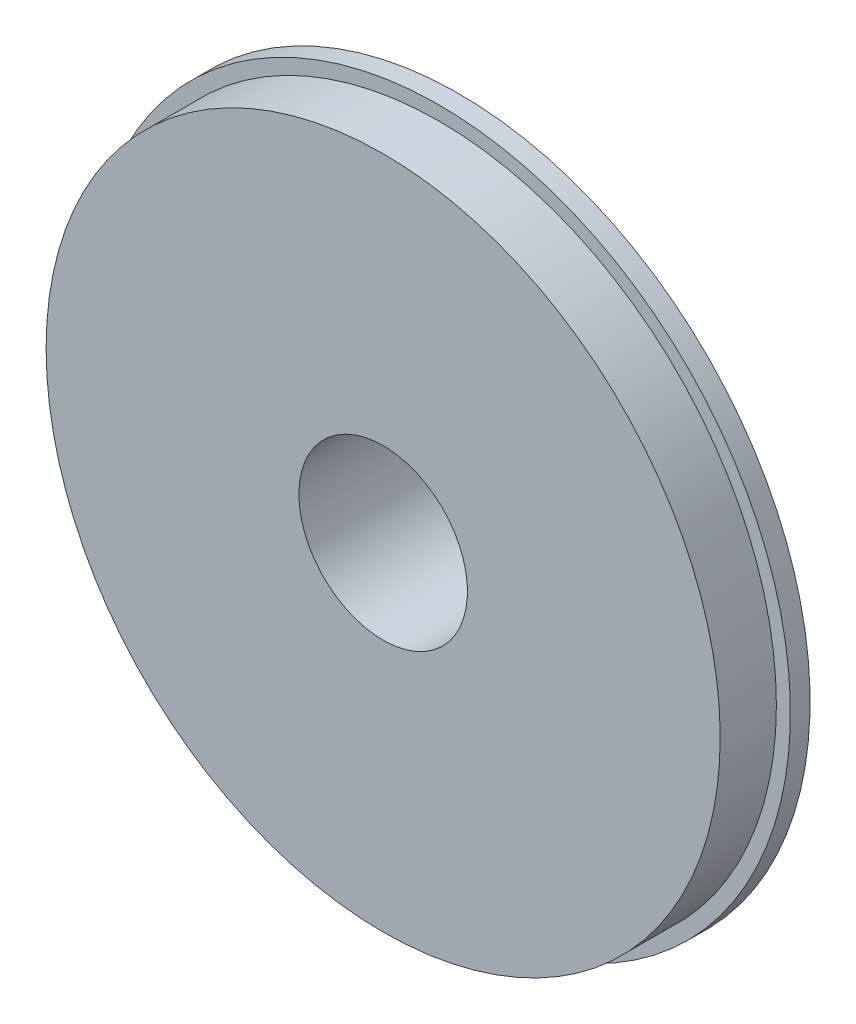
ISO-10303-21;
HEADER;
FILE_DESCRIPTION(('STEP AP214'),'2;1');
FILE_NAME('part.step','',(''),(''),'','','');
FILE_SCHEMA(('AUTOMOTIVE_DESIGN { 1 0 10303 214 1 1 1 1 }'));
ENDSEC;
DATA;
#1=APPLICATION_CONTEXT('core data for automotive mechanical design processes');
#2=APPLICATION_PROTOCOL_DEFINITION('international standard','automotive_design',2000,#1);
#3=PRODUCT_CONTEXT('',#1,'mechanical');
#4=PRODUCT('Part','Part','',(#3));
#5=PRODUCT_RELATED_PRODUCT_CATEGORY('part','',(#4));
#6=PRODUCT_DEFINITION_FORMATION('','',#4);
#7=PRODUCT_DEFINITION_CONTEXT('part definition',#1,'design');
#8=PRODUCT_DEFINITION('design','',#6,#7);
#9=PRODUCT_DEFINITION_SHAPE('','',#8);
#10=(LENGTH_UNIT() NAMED_UNIT(*) SI_UNIT(.MILLI.,.METRE.));
#11=(NAMED_UNIT(*) PLANE_ANGLE_UNIT() SI_UNIT($,.RADIAN.));
#12=(NAMED_UNIT(*) SI_UNIT($,.STERADIAN.) SOLID_ANGLE_UNIT());
#13=UNCERTAINTY_MEASURE_WITH_UNIT(LENGTH_MEASURE(1.E-05),#10,'distance_accuracy_value','');
#14=(GEOMETRIC_REPRESENTATION_CONTEXT(3) GLOBAL_UNCERTAINTY_ASSIGNED_CONTEXT((#13)) GLOBAL_UNIT_ASSIGNED_CONTEXT((#10,
#11,#12)) REPRESENTATION_CONTEXT('',''));
#15=CARTESIAN_POINT('',(0.,0.,0.));
#16=DIRECTION('',(0.,0.,1.));
#17=DIRECTION('',(1.,0.,0.));
#18=AXIS2_PLACEMENT_3D('',#15,#16,#17);
#19=CARTESIAN_POINT('',(0.,0.,2.));
#20=DIRECTION('',(0.,0.,-1.));
#21=DIRECTION('',(-1.,0.,0.));
#22=AXIS2_PLACEMENT_3D('',#19,#20,#21);
#23=CYLINDRICAL_SURFACE('',#22,12.);
#24=CARTESIAN_POINT('',(0.,0.,2.));
#25=DIRECTION('',(0.,0.,1.));
#26=DIRECTION('',(1.,0.,0.));
#27=AXIS2_PLACEMENT_3D('',#24,#25,#26);
#28=CIRCLE('',#27,12.);
#29=CARTESIAN_POINT('',(12.,0.,2.));
#30=VERTEX_POINT('',#29);
#31=EDGE_CURVE('E36',#30,#30,#28,.T.);
#32=ORIENTED_EDGE('',*,*,#31,.F.);
#33=EDGE_LOOP('',(#32));
#34=FACE_BOUND('',#33,.T.);
#35=CARTESIAN_POINT('',(0.,0.,0.));
#36=DIRECTION('',(0.,0.,-1.));
#37=DIRECTION('',(-1.,0.,0.));
#38=AXIS2_PLACEMENT_3D('',#35,#36,#37);
#39=CIRCLE('',#38,12.);
#40=CARTESIAN_POINT('',(-12.,0.,0.));
#41=VERTEX_POINT('',#40);
#42=EDGE_CURVE('E40',#41,#41,#39,.T.);
#43=ORIENTED_EDGE('',*,*,#42,.F.);
#44=EDGE_LOOP('',(#43));
#45=FACE_BOUND('',#44,.T.);
#46=ADVANCED_FACE('F30',(#34,#45),#23,.T.);
#47=CARTESIAN_POINT('',(0.,0.,2.));
#48=DIRECTION('',(0.,0.,1.));
#49=DIRECTION('',(1.,0.,0.));
#50=AXIS2_PLACEMENT_3D('',#47,#48,#49);
#51=PLANE('',#50);
#52=CARTESIAN_POINT('',(0.,0.,2.));
#53=DIRECTION('',(0.,0.,-1.));
#54=DIRECTION('',(-1.,0.,0.));
#55=AXIS2_PLACEMENT_3D('',#52,#53,#54);
#56=CIRCLE('',#55,3.);
#57=CARTESIAN_POINT('',(-3.,0.,2.));
#58=VERTEX_POINT('',#57);
#59=EDGE_CURVE('E56',#58,#58,#56,.T.);
#60=ORIENTED_EDGE('',*,*,#59,.T.);
#61=EDGE_LOOP('',(#60));
#62=FACE_BOUND('',#61,.T.);
#63=ORIENTED_EDGE('',*,*,#31,.T.);
#64=EDGE_LOOP('',(#63));
#65=FACE_BOUND('',#64,.T.);
#66=ADVANCED_FACE('F86',(#62,#65),#51,.T.);
#67=CARTESIAN_POINT('',(0.,0.,-0.7));
#68=DIRECTION('',(0.,0.,-1.));
#69=DIRECTION('',(-1.,0.,0.));
#70=AXIS2_PLACEMENT_3D('',#67,#68,#69);
#71=PLANE('',#70);
#72=CARTESIAN_POINT('',(0.,0.,-0.7));
#73=DIRECTION('',(0.,0.,-1.));
#74=DIRECTION('',(-1.,0.,0.));
#75=AXIS2_PLACEMENT_3D('',#72,#73,#74);
#76=CIRCLE('',#75,12.5);
#77=CARTESIAN_POINT('',(-12.5,0.,-0.7));
#78=VERTEX_POINT('',#77);
#79=EDGE_CURVE('E44',#78,#78,#76,.T.);
#80=ORIENTED_EDGE('',*,*,#79,.T.);
#81=EDGE_LOOP('',(#80));
#82=FACE_BOUND('',#81,.T.);
#83=CARTESIAN_POINT('',(0.,0.,-0.7));
#84=DIRECTION('',(0.,0.,-1.));
#85=DIRECTION('',(-1.,0.,0.));
#86=AXIS2_PLACEMENT_3D('',#83,#84,#85);
#87=CIRCLE('',#86,11.5);
#88=CARTESIAN_POINT('',(-11.5,0.,-0.7));
#89=VERTEX_POINT('',#88);
#90=EDGE_CURVE('E50',#89,#89,#87,.T.);
#91=ORIENTED_EDGE('',*,*,#90,.F.);
#92=EDGE_LOOP('',(#91));
#93=FACE_BOUND('',#92,.T.);
#94=ADVANCED_FACE('F91',(#82,#93),#71,.T.);
#95=CARTESIAN_POINT('',(0.,0.,0.));
#96=DIRECTION('',(0.,0.,-1.));
#97=DIRECTION('',(-1.,0.,0.));
#98=AXIS2_PLACEMENT_3D('',#95,#96,#97);
#99=PLANE('',#98);
#100=ORIENTED_EDGE('',*,*,#42,.T.);
#101=EDGE_LOOP('',(#100));
#102=FACE_BOUND('',#101,.T.);
#103=CARTESIAN_POINT('',(0.,0.,0.));
#104=DIRECTION('',(0.,0.,-1.));
#105=DIRECTION('',(-1.,0.,0.));
#106=AXIS2_PLACEMENT_3D('',#103,#104,#105);
#107=CIRCLE('',#106,12.5);
#108=CARTESIAN_POINT('',(-12.5,0.,0.));
#109=VERTEX_POINT('',#108);
#110=EDGE_CURVE('E47',#109,#109,#107,.T.);
#111=ORIENTED_EDGE('',*,*,#110,.F.);
#112=EDGE_LOOP('',(#111));
#113=FACE_BOUND('',#112,.T.);
#114=ADVANCED_FACE('F97',(#102,#113),#99,.F.);
#115=CARTESIAN_POINT('',(0.,0.,-0.7));
#116=DIRECTION('',(0.,0.,1.));
#117=DIRECTION('',(1.,0.,0.));
#118=AXIS2_PLACEMENT_3D('',#115,#116,#117);
#119=CYLINDRICAL_SURFACE('',#118,12.5);
#120=ORIENTED_EDGE('',*,*,#79,.F.);
#121=EDGE_LOOP('',(#120));
#122=FACE_BOUND('',#121,.T.);
#123=ORIENTED_EDGE('',*,*,#110,.T.);
#124=EDGE_LOOP('',(#123));
#125=FACE_BOUND('',#124,.T.);
#126=ADVANCED_FACE('F100',(#122,#125),#119,.T.);
#127=CARTESIAN_POINT('',(0.,0.,-0.7));
#128=DIRECTION('',(0.,0.,1.));
#129=DIRECTION('',(1.,0.,0.));
#130=AXIS2_PLACEMENT_3D('',#127,#128,#129);
#131=CYLINDRICAL_SURFACE('',#130,11.5);
#132=ORIENTED_EDGE('',*,*,#90,.T.);
#133=EDGE_LOOP('',(#132));
#134=FACE_BOUND('',#133,.T.);
#135=CARTESIAN_POINT('',(0.,0.,0.));
#136=DIRECTION('',(0.,0.,-1.));
#137=DIRECTION('',(-1.,0.,0.));
#138=AXIS2_PLACEMENT_3D('',#135,#136,#137);
#139=CIRCLE('',#138,11.5);
#140=CARTESIAN_POINT('',(-11.5,0.,0.));
#141=VERTEX_POINT('',#140);
#142=EDGE_CURVE('E53',#141,#141,#139,.T.);
#143=ORIENTED_EDGE('',*,*,#142,.F.);
#144=EDGE_LOOP('',(#143));
#145=FACE_BOUND('',#144,.T.);
#146=ADVANCED_FACE('F105',(#134,#145),#131,.F.);
#147=CARTESIAN_POINT('',(0.,0.,0.));
#148=DIRECTION('',(0.,0.,1.));
#149=DIRECTION('',(1.,0.,0.));
#150=AXIS2_PLACEMENT_3D('',#147,#148,#149);
#151=PLANE('',#150);
#152=CARTESIAN_POINT('',(0.,0.,0.));
#153=DIRECTION('',(0.,0.,1.));
#154=DIRECTION('',(1.,0.,0.));
#155=AXIS2_PLACEMENT_3D('',#152,#153,#154);
#156=CIRCLE('',#155,7.5);
#157=CARTESIAN_POINT('',(7.5,0.,0.));
#158=VERTEX_POINT('',#157);
#159=EDGE_CURVE('E10',#158,#158,#156,.F.);
#160=ORIENTED_EDGE('',*,*,#159,.F.);
#161=EDGE_LOOP('',(#160));
#162=FACE_BOUND('',#161,.T.);
#163=ORIENTED_EDGE('',*,*,#142,.T.);
#164=EDGE_LOOP('',(#163));
#165=FACE_BOUND('',#164,.T.);
#166=ADVANCED_FACE('F82',(#162,#165),#151,.F.);
#167=CARTESIAN_POINT('',(0.,0.,2.));
#168=DIRECTION('',(0.,0.,-1.));
#169=DIRECTION('',(-1.,0.,0.));
#170=AXIS2_PLACEMENT_3D('',#167,#168,#169);
#171=CYLINDRICAL_SURFACE('',#170,3.);
#172=ORIENTED_EDGE('',*,*,#59,.F.);
#173=EDGE_LOOP('',(#172));
#174=FACE_BOUND('',#173,.T.);
#175=CARTESIAN_POINT('',(0.,0.,-2.7));
#176=DIRECTION('',(0.,0.,-1.));
#177=DIRECTION('',(-1.,0.,0.));
#178=AXIS2_PLACEMENT_3D('',#175,#176,#177);
#179=CIRCLE('',#178,3.);
#180=CARTESIAN_POINT('',(-3.,0.,-2.7));
#181=VERTEX_POINT('',#180);
#182=EDGE_CURVE('E64',#181,#181,#179,.T.);
#183=ORIENTED_EDGE('',*,*,#182,.T.);
#184=EDGE_LOOP('',(#183));
#185=FACE_BOUND('',#184,.T.);
#186=ADVANCED_FACE('F68',(#174,#185),#171,.F.);
#187=CARTESIAN_POINT('',(0.,0.,-2.7));
#188=DIRECTION('',(0.,0.,1.));
#189=DIRECTION('',(1.,0.,0.));
#190=AXIS2_PLACEMENT_3D('',#187,#188,#189);
#191=CYLINDRICAL_SURFACE('',#190,7.5);
#192=CARTESIAN_POINT('',(0.,0.,-2.7));
#193=DIRECTION('',(0.,0.,-1.));
#194=DIRECTION('',(-1.,0.,0.));
#195=AXIS2_PLACEMENT_3D('',#192,#193,#194);
#196=CIRCLE('',#195,7.5);
#197=CARTESIAN_POINT('',(7.5,0.,-2.7));
#198=VERTEX_POINT('',#197);
#199=EDGE_CURVE('E61',#198,#198,#196,.T.);
#200=CARTESIAN_POINT('',(7.5,0.,-2.7));
#201=CARTESIAN_POINT('',(7.5,0.,-2.671875));
#202=CARTESIAN_POINT('',(7.5,0.,-2.64375));
#203=CARTESIAN_POINT('',(7.5,0.,-2.5875));
#204=CARTESIAN_POINT('',(7.5,0.,-2.559375));
#205=CARTESIAN_POINT('',(7.5,0.,-2.503125));
#206=CARTESIAN_POINT('',(7.5,0.,-2.475));
#207=CARTESIAN_POINT('',(7.5,0.,-2.41875));
#208=CARTESIAN_POINT('',(7.5,0.,-2.390625));
#209=CARTESIAN_POINT('',(7.5,0.,-2.334375));
#210=CARTESIAN_POINT('',(7.5,0.,-2.30625));
#211=CARTESIAN_POINT('',(7.5,0.,-2.25));
#212=CARTESIAN_POINT('',(7.5,0.,-2.221875));
#213=CARTESIAN_POINT('',(7.5,0.,-2.165625));
#214=CARTESIAN_POINT('',(7.5,0.,-2.1375));
#215=CARTESIAN_POINT('',(7.5,0.,-2.08125));
#216=CARTESIAN_POINT('',(7.5,0.,-2.053125));
#217=CARTESIAN_POINT('',(7.5,0.,-1.996875));
#218=CARTESIAN_POINT('',(7.5,0.,-1.96875));
#219=CARTESIAN_POINT('',(7.5,0.,-1.9125));
#220=CARTESIAN_POINT('',(7.5,0.,-1.884375));
#221=CARTESIAN_POINT('',(7.5,0.,-1.828125));
#222=CARTESIAN_POINT('',(7.5,0.,-1.8));
#223=CARTESIAN_POINT('',(7.5,0.,-1.74375));
#224=CARTESIAN_POINT('',(7.5,0.,-1.715625));
#225=CARTESIAN_POINT('',(7.5,0.,-1.659375));
#226=CARTESIAN_POINT('',(7.5,0.,-1.63125));
#227=CARTESIAN_POINT('',(7.5,0.,-1.575));
#228=CARTESIAN_POINT('',(7.5,0.,-1.546875));
#229=CARTESIAN_POINT('',(7.5,0.,-1.490625));
#230=CARTESIAN_POINT('',(7.5,0.,-1.4625));
#231=CARTESIAN_POINT('',(7.5,0.,-1.40625));
#232=CARTESIAN_POINT('',(7.5,0.,-1.378125));
#233=CARTESIAN_POINT('',(7.5,0.,-1.321875));
#234=CARTESIAN_POINT('',(7.5,0.,-1.29375));
#235=CARTESIAN_POINT('',(7.5,0.,-1.2375));
#236=CARTESIAN_POINT('',(7.5,0.,-1.209375));
#237=CARTESIAN_POINT('',(7.5,0.,-1.153125));
#238=CARTESIAN_POINT('',(7.5,0.,-1.125));
#239=CARTESIAN_POINT('',(7.5,0.,-1.06875));
#240=CARTESIAN_POINT('',(7.5,0.,-1.040625));
#241=CARTESIAN_POINT('',(7.5,0.,-0.984375));
#242=CARTESIAN_POINT('',(7.5,0.,-0.95625));
#243=CARTESIAN_POINT('',(7.5,0.,-0.9));
#244=CARTESIAN_POINT('',(7.5,0.,-0.871875));
#245=CARTESIAN_POINT('',(7.5,0.,-0.815625));
#246=CARTESIAN_POINT('',(7.5,0.,-0.7875));
#247=CARTESIAN_POINT('',(7.5,0.,-0.73125));
#248=CARTESIAN_POINT('',(7.5,0.,-0.703125000000001));
#249=CARTESIAN_POINT('',(7.5,0.,-0.646875000000001));
#250=CARTESIAN_POINT('',(7.5,0.,-0.61875));
#251=CARTESIAN_POINT('',(7.5,0.,-0.5625));
#252=CARTESIAN_POINT('',(7.5,0.,-0.534375000000001));
#253=CARTESIAN_POINT('',(7.5,0.,-0.478125000000001));
#254=CARTESIAN_POINT('',(7.5,0.,-0.45));
#255=CARTESIAN_POINT('',(7.5,0.,-0.39375));
#256=CARTESIAN_POINT('',(7.5,0.,-0.365625));
#257=CARTESIAN_POINT('',(7.5,0.,-0.309375));
#258=CARTESIAN_POINT('',(7.5,0.,-0.28125));
#259=CARTESIAN_POINT('',(7.5,0.,-0.225));
#260=CARTESIAN_POINT('',(7.5,0.,-0.196875));
#261=CARTESIAN_POINT('',(7.5,0.,-0.140625));
#262=CARTESIAN_POINT('',(7.5,0.,-0.1125));
#263=CARTESIAN_POINT('',(7.5,0.,-0.0562500000000003));
#264=CARTESIAN_POINT('',(7.5,0.,-0.0281250000000003));
#265=CARTESIAN_POINT('',(7.5,0.,0.));
#266=B_SPLINE_CURVE_WITH_KNOTS('',3,(#200,#201,#202,#203,#204,#205,#206,#207,#208,#209,#210,
#211,#212,#213,#214,#215,#216,#217,#218,#219,#220,#221,#222,#223,#224,#225,#226,#227,#228,#229,
#230,#231,#232,#233,#234,#235,#236,#237,#238,#239,#240,#241,#242,#243,#244,#245,#246,#247,#248,
#249,#250,#251,#252,#253,#254,#255,#256,#257,#258,#259,#260,#261,#262,#263,#264,#265),
.UNSPECIFIED.,.F.,.F.,(4,2,2,2,2,2,2,2,2,2,2,2,2,2,2,2,2,2,2,2,2,2,2,2,2,2,2,2,2,2,2,2,4),(0.,
0.0843750000000003,0.16875,0.253125,0.3375,0.421875,0.50625,0.590625,0.675,0.759375,0.84375,
0.928125,1.0125,1.096875,1.18125,1.265625,1.35,1.434375,1.51875,1.603125,1.6875,1.771875,
1.85625,1.940625,2.025,2.109375,2.19375,2.278125,2.3625,2.446875,2.53125,2.615625,2.7),.UNSPECIFIED.);
#267=EDGE_CURVE('BSEAM73',#198,#158,#266,.T.);
#268=ORIENTED_EDGE('',*,*,#199,.F.);
#269=ORIENTED_EDGE('',*,*,#159,.T.);
#270=ORIENTED_EDGE('',*,*,#267,.T.);
#271=ORIENTED_EDGE('',*,*,#267,.F.);
#272=EDGE_LOOP('',(#268,#270,#269,#271));
#273=FACE_BOUND('',#272,.T.);
#274=ADVANCED_FACE('F73',(#273),#191,.T.);
#275=CARTESIAN_POINT('',(0.,0.,-2.7));
#276=DIRECTION('',(0.,0.,-1.));
#277=DIRECTION('',(-1.,0.,0.));
#278=AXIS2_PLACEMENT_3D('',#275,#276,#277);
#279=PLANE('',#278);
#280=ORIENTED_EDGE('',*,*,#182,.F.);
#281=EDGE_LOOP('',(#280));
#282=FACE_BOUND('',#281,.T.);
#283=ORIENTED_EDGE('',*,*,#199,.T.);
#284=EDGE_LOOP('',(#283));
#285=FACE_BOUND('',#284,.T.);
#286=ADVANCED_FACE('F70',(#282,#285),#279,.T.);
#287=CLOSED_SHELL('',(#46,#66,#94,#114,#126,#146,#166,#186,#274,#286));
#288=MANIFOLD_SOLID_BREP('B2',#287);
#289=ADVANCED_BREP_SHAPE_REPRESENTATION('',(#18,#288),#14);
#290=SHAPE_DEFINITION_REPRESENTATION(#9,#289);
ENDSEC;
END-ISO-10303-21;
